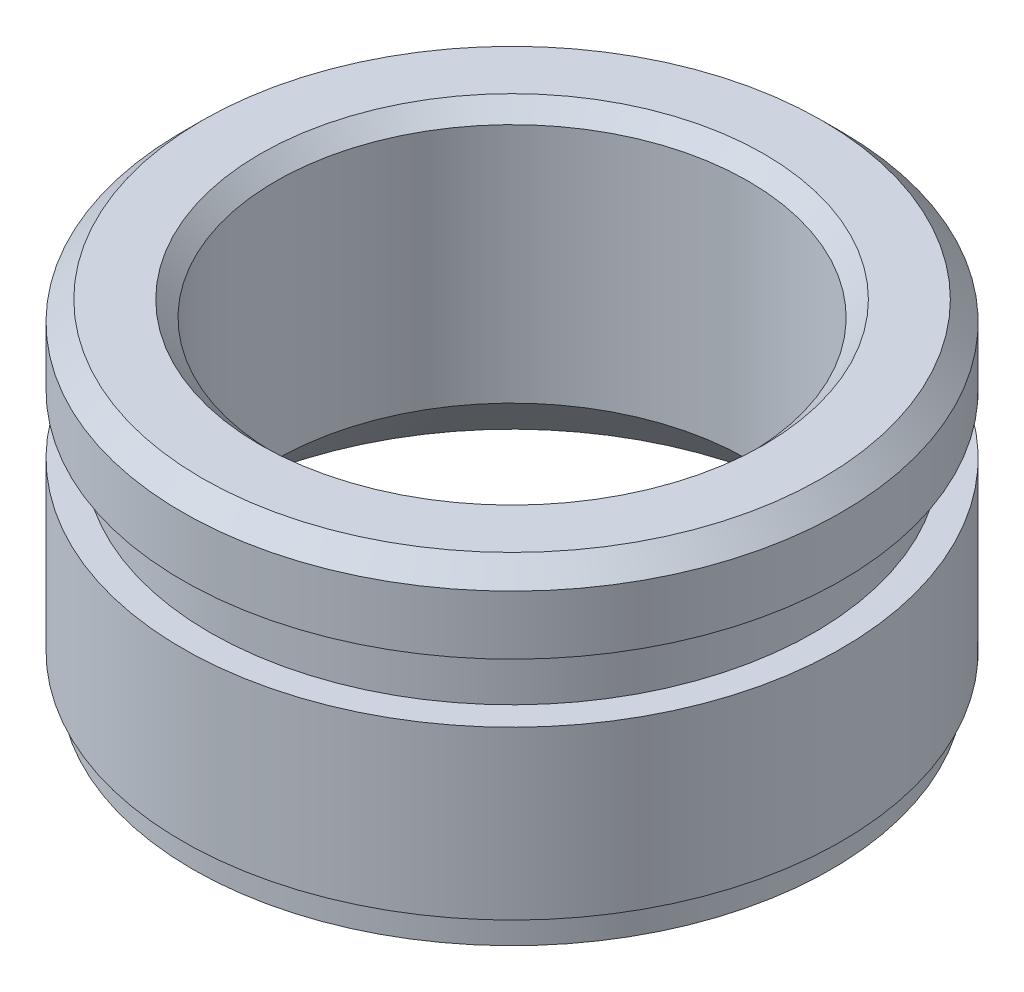
ISO-10303-21;
HEADER;
FILE_DESCRIPTION(('STEP AP214'),'2;1');
FILE_NAME('part.step','',(''),(''),'','','');
FILE_SCHEMA(('AUTOMOTIVE_DESIGN { 1 0 10303 214 1 1 1 1 }'));
ENDSEC;
DATA;
#1=APPLICATION_CONTEXT('core data for automotive mechanical design processes');
#2=APPLICATION_PROTOCOL_DEFINITION('international standard','automotive_design',2000,#1);
#3=PRODUCT_CONTEXT('',#1,'mechanical');
#4=PRODUCT('Part','Part','',(#3));
#5=PRODUCT_RELATED_PRODUCT_CATEGORY('part','',(#4));
#6=PRODUCT_DEFINITION_FORMATION('','',#4);
#7=PRODUCT_DEFINITION_CONTEXT('part definition',#1,'design');
#8=PRODUCT_DEFINITION('design','',#6,#7);
#9=PRODUCT_DEFINITION_SHAPE('','',#8);
#10=(LENGTH_UNIT() NAMED_UNIT(*) SI_UNIT(.MILLI.,.METRE.));
#11=(NAMED_UNIT(*) PLANE_ANGLE_UNIT() SI_UNIT($,.RADIAN.));
#12=(NAMED_UNIT(*) SI_UNIT($,.STERADIAN.) SOLID_ANGLE_UNIT());
#13=UNCERTAINTY_MEASURE_WITH_UNIT(LENGTH_MEASURE(1.E-05),#10,'distance_accuracy_value','');
#14=(GEOMETRIC_REPRESENTATION_CONTEXT(3) GLOBAL_UNCERTAINTY_ASSIGNED_CONTEXT((#13)) GLOBAL_UNIT_ASSIGNED_CONTEXT((#10,
#11,#12)) REPRESENTATION_CONTEXT('',''));
#15=CARTESIAN_POINT('',(0.,0.,0.));
#16=DIRECTION('',(0.,0.,1.));
#17=DIRECTION('',(1.,0.,0.));
#18=AXIS2_PLACEMENT_3D('',#15,#16,#17);
#19=CARTESIAN_POINT('',(0.,3.925,0.));
#20=DIRECTION('',(0.,1.,0.));
#21=DIRECTION('',(0.,0.,1.));
#22=AXIS2_PLACEMENT_3D('',#19,#20,#21);
#23=CYLINDRICAL_SURFACE('',#22,12.025);
#24=CARTESIAN_POINT('',(0.,3.925,0.));
#25=DIRECTION('',(0.,1.,0.));
#26=DIRECTION('',(0.,0.,1.));
#27=AXIS2_PLACEMENT_3D('',#24,#25,#26);
#28=CIRCLE('',#27,12.025);
#29=CARTESIAN_POINT('',(0.,3.925,12.025));
#30=VERTEX_POINT('',#29);
#31=EDGE_CURVE('E54',#30,#30,#28,.T.);
#32=ORIENTED_EDGE('',*,*,#31,.F.);
#33=EDGE_LOOP('',(#32));
#34=FACE_BOUND('',#33,.T.);
#35=CARTESIAN_POINT('',(0.,16.2,0.));
#36=DIRECTION('',(0.,-1.,0.));
#37=DIRECTION('',(0.,0.,-1.));
#38=AXIS2_PLACEMENT_3D('',#35,#36,#37);
#39=CIRCLE('',#38,12.025);
#40=CARTESIAN_POINT('',(0.,16.2,-12.025));
#41=VERTEX_POINT('',#40);
#42=EDGE_CURVE('E58',#41,#41,#39,.T.);
#43=ORIENTED_EDGE('',*,*,#42,.F.);
#44=EDGE_LOOP('',(#43));
#45=FACE_BOUND('',#44,.T.);
#46=ADVANCED_FACE('F13',(#34,#45),#23,.F.);
#47=CARTESIAN_POINT('',(0.,16.2,0.));
#48=DIRECTION('',(0.,1.,0.));
#49=DIRECTION('',(0.,0.,1.));
#50=AXIS2_PLACEMENT_3D('',#47,#48,#49);
#51=CONICAL_SURFACE('',#50,12.025,0.785398163397447);
#52=ORIENTED_EDGE('',*,*,#42,.T.);
#53=EDGE_LOOP('',(#52));
#54=FACE_BOUND('',#53,.T.);
#55=CARTESIAN_POINT('',(0.,17.,0.));
#56=DIRECTION('',(0.,1.,0.));
#57=DIRECTION('',(0.,0.,1.));
#58=AXIS2_PLACEMENT_3D('',#55,#56,#57);
#59=CIRCLE('',#58,12.825);
#60=CARTESIAN_POINT('',(0.,17.,12.825));
#61=VERTEX_POINT('',#60);
#62=EDGE_CURVE('E17',#61,#61,#59,.F.);
#63=ORIENTED_EDGE('',*,*,#62,.F.);
#64=EDGE_LOOP('',(#63));
#65=FACE_BOUND('',#64,.T.);
#66=ADVANCED_FACE('F91',(#54,#65),#51,.F.);
#67=CARTESIAN_POINT('',(0.,0.,0.));
#68=DIRECTION('',(0.,-1.,0.));
#69=DIRECTION('',(0.,0.,-1.));
#70=AXIS2_PLACEMENT_3D('',#67,#68,#69);
#71=CONICAL_SURFACE('',#70,15.95,0.785398163397449);
#72=CARTESIAN_POINT('',(0.,0.,0.));
#73=DIRECTION('',(0.,-1.,0.));
#74=DIRECTION('',(0.,0.,-1.));
#75=AXIS2_PLACEMENT_3D('',#72,#73,#74);
#76=CIRCLE('',#75,15.95);
#77=CARTESIAN_POINT('',(0.,0.,-15.95));
#78=VERTEX_POINT('',#77);
#79=EDGE_CURVE('E49',#78,#78,#76,.F.);
#80=ORIENTED_EDGE('',*,*,#79,.F.);
#81=EDGE_LOOP('',(#80));
#82=FACE_BOUND('',#81,.T.);
#83=ORIENTED_EDGE('',*,*,#31,.T.);
#84=EDGE_LOOP('',(#83));
#85=FACE_BOUND('',#84,.T.);
#86=ADVANCED_FACE('F83',(#82,#85),#71,.F.);
#87=CARTESIAN_POINT('',(-15.775,17.,-16.0905));
#88=DIRECTION('',(0.,1.,0.));
#89=DIRECTION('',(0.,0.,1.));
#90=AXIS2_PLACEMENT_3D('',#87,#88,#89);
#91=PLANE('',#90);
#92=ORIENTED_EDGE('',*,*,#62,.T.);
#93=EDGE_LOOP('',(#92));
#94=FACE_BOUND('',#93,.T.);
#95=CARTESIAN_POINT('',(0.,17.,0.));
#96=DIRECTION('',(0.,-1.,0.));
#97=DIRECTION('',(0.,0.,-1.));
#98=AXIS2_PLACEMENT_3D('',#95,#96,#97);
#99=CIRCLE('',#98,15.775);
#100=CARTESIAN_POINT('',(0.,17.,-15.775));
#101=VERTEX_POINT('',#100);
#102=EDGE_CURVE('E47',#101,#101,#99,.T.);
#103=ORIENTED_EDGE('',*,*,#102,.F.);
#104=EDGE_LOOP('',(#103));
#105=FACE_BOUND('',#104,.T.);
#106=ADVANCED_FACE('F81',(#94,#105),#91,.T.);
#107=CARTESIAN_POINT('',(-16.25,0.,16.575));
#108=DIRECTION('',(0.,-1.,0.));
#109=DIRECTION('',(0.,0.,-1.));
#110=AXIS2_PLACEMENT_3D('',#107,#108,#109);
#111=PLANE('',#110);
#112=ORIENTED_EDGE('',*,*,#79,.T.);
#113=EDGE_LOOP('',(#112));
#114=FACE_BOUND('',#113,.T.);
#115=CARTESIAN_POINT('',(0.,0.,0.));
#116=DIRECTION('',(0.,-1.,0.));
#117=DIRECTION('',(0.,0.,-1.));
#118=AXIS2_PLACEMENT_3D('',#115,#116,#117);
#119=CIRCLE('',#118,16.25);
#120=CARTESIAN_POINT('',(0.,0.,-16.25));
#121=VERTEX_POINT('',#120);
#122=EDGE_CURVE('E44',#121,#121,#119,.F.);
#123=ORIENTED_EDGE('',*,*,#122,.F.);
#124=EDGE_LOOP('',(#123));
#125=FACE_BOUND('',#124,.T.);
#126=ADVANCED_FACE('F77',(#114,#125),#111,.T.);
#127=CARTESIAN_POINT('',(0.,17.,0.));
#128=DIRECTION('',(0.,-1.,0.));
#129=DIRECTION('',(0.,0.,-1.));
#130=AXIS2_PLACEMENT_3D('',#127,#128,#129);
#131=CONICAL_SURFACE('',#130,15.775,0.785398163397447);
#132=CARTESIAN_POINT('',(0.,16.,0.));
#133=DIRECTION('',(0.,-1.,0.));
#134=DIRECTION('',(0.,0.,-1.));
#135=AXIS2_PLACEMENT_3D('',#132,#133,#134);
#136=CIRCLE('',#135,16.775);
#137=CARTESIAN_POINT('',(0.,16.,-16.775));
#138=VERTEX_POINT('',#137);
#139=EDGE_CURVE('E43',#138,#138,#136,.T.);
#140=ORIENTED_EDGE('',*,*,#139,.F.);
#141=EDGE_LOOP('',(#140));
#142=FACE_BOUND('',#141,.T.);
#143=ORIENTED_EDGE('',*,*,#102,.T.);
#144=EDGE_LOOP('',(#143));
#145=FACE_BOUND('',#144,.T.);
#146=ADVANCED_FACE('F73',(#142,#145),#131,.T.);
#147=CARTESIAN_POINT('',(0.,1.5,0.));
#148=DIRECTION('',(0.,-1.,0.));
#149=DIRECTION('',(0.,0.,-1.));
#150=AXIS2_PLACEMENT_3D('',#147,#148,#149);
#151=CYLINDRICAL_SURFACE('',#150,16.25);
#152=ORIENTED_EDGE('',*,*,#122,.T.);
#153=EDGE_LOOP('',(#152));
#154=FACE_BOUND('',#153,.T.);
#155=CARTESIAN_POINT('',(0.,1.5,0.));
#156=DIRECTION('',(0.,-1.,0.));
#157=DIRECTION('',(0.,0.,-1.));
#158=AXIS2_PLACEMENT_3D('',#155,#156,#157);
#159=CIRCLE('',#158,16.25);
#160=CARTESIAN_POINT('',(0.,1.5,-16.25));
#161=VERTEX_POINT('',#160);
#162=EDGE_CURVE('E40',#161,#161,#159,.F.);
#163=ORIENTED_EDGE('',*,*,#162,.F.);
#164=EDGE_LOOP('',(#163));
#165=FACE_BOUND('',#164,.T.);
#166=ADVANCED_FACE('F76',(#154,#165),#151,.T.);
#167=CARTESIAN_POINT('',(0.,16.,0.));
#168=DIRECTION('',(0.,-1.,0.));
#169=DIRECTION('',(0.,0.,-1.));
#170=AXIS2_PLACEMENT_3D('',#167,#168,#169);
#171=CYLINDRICAL_SURFACE('',#170,16.775);
#172=CARTESIAN_POINT('',(0.,13.,0.));
#173=DIRECTION('',(0.,-1.,0.));
#174=DIRECTION('',(0.,0.,-1.));
#175=AXIS2_PLACEMENT_3D('',#172,#173,#174);
#176=CIRCLE('',#175,16.775);
#177=CARTESIAN_POINT('',(0.,13.,-16.775));
#178=VERTEX_POINT('',#177);
#179=EDGE_CURVE('E37',#178,#178,#176,.T.);
#180=ORIENTED_EDGE('',*,*,#179,.F.);
#181=EDGE_LOOP('',(#180));
#182=FACE_BOUND('',#181,.T.);
#183=ORIENTED_EDGE('',*,*,#139,.T.);
#184=EDGE_LOOP('',(#183));
#185=FACE_BOUND('',#184,.T.);
#186=ADVANCED_FACE('F71',(#182,#185),#171,.T.);
#187=CARTESIAN_POINT('',(-16.775,1.5,17.1105));
#188=DIRECTION('',(0.,-1.,0.));
#189=DIRECTION('',(0.,0.,-1.));
#190=AXIS2_PLACEMENT_3D('',#187,#188,#189);
#191=PLANE('',#190);
#192=ORIENTED_EDGE('',*,*,#162,.T.);
#193=EDGE_LOOP('',(#192));
#194=FACE_BOUND('',#193,.T.);
#195=CARTESIAN_POINT('',(0.,1.5,0.));
#196=DIRECTION('',(0.,-1.,0.));
#197=DIRECTION('',(0.,0.,-1.));
#198=AXIS2_PLACEMENT_3D('',#195,#196,#197);
#199=CIRCLE('',#198,16.775);
#200=CARTESIAN_POINT('',(0.,1.5,-16.775));
#201=VERTEX_POINT('',#200);
#202=EDGE_CURVE('E34',#201,#201,#199,.F.);
#203=ORIENTED_EDGE('',*,*,#202,.F.);
#204=EDGE_LOOP('',(#203));
#205=FACE_BOUND('',#204,.T.);
#206=ADVANCED_FACE('F111',(#194,#205),#191,.T.);
#207=CARTESIAN_POINT('',(-17.1105,13.,16.775));
#208=DIRECTION('',(0.,-1.,0.));
#209=DIRECTION('',(0.,0.,-1.));
#210=AXIS2_PLACEMENT_3D('',#207,#208,#209);
#211=PLANE('',#210);
#212=CARTESIAN_POINT('',(0.,13.,0.));
#213=DIRECTION('',(0.,1.,0.));
#214=DIRECTION('',(0.,0.,1.));
#215=AXIS2_PLACEMENT_3D('',#212,#213,#214);
#216=CIRCLE('',#215,15.375);
#217=CARTESIAN_POINT('',(0.,13.,15.375));
#218=VERTEX_POINT('',#217);
#219=EDGE_CURVE('E26',#218,#218,#216,.F.);
#220=ORIENTED_EDGE('',*,*,#219,.F.);
#221=EDGE_LOOP('',(#220));
#222=FACE_BOUND('',#221,.T.);
#223=ORIENTED_EDGE('',*,*,#179,.T.);
#224=EDGE_LOOP('',(#223));
#225=FACE_BOUND('',#224,.T.);
#226=ADVANCED_FACE('F105',(#222,#225),#211,.T.);
#227=CARTESIAN_POINT('',(0.,10.,0.));
#228=DIRECTION('',(0.,-1.,0.));
#229=DIRECTION('',(0.,0.,-1.));
#230=AXIS2_PLACEMENT_3D('',#227,#228,#229);
#231=CYLINDRICAL_SURFACE('',#230,16.775);
#232=ORIENTED_EDGE('',*,*,#202,.T.);
#233=EDGE_LOOP('',(#232));
#234=FACE_BOUND('',#233,.T.);
#235=CARTESIAN_POINT('',(0.,10.,0.));
#236=DIRECTION('',(0.,-1.,0.));
#237=DIRECTION('',(0.,0.,-1.));
#238=AXIS2_PLACEMENT_3D('',#235,#236,#237);
#239=CIRCLE('',#238,16.775);
#240=CARTESIAN_POINT('',(0.,10.,-16.775));
#241=VERTEX_POINT('',#240);
#242=EDGE_CURVE('E21',#241,#241,#239,.F.);
#243=ORIENTED_EDGE('',*,*,#242,.F.);
#244=EDGE_LOOP('',(#243));
#245=FACE_BOUND('',#244,.T.);
#246=ADVANCED_FACE('F99',(#234,#245),#231,.T.);
#247=CARTESIAN_POINT('',(0.,10.,0.));
#248=DIRECTION('',(0.,1.,0.));
#249=DIRECTION('',(0.,0.,1.));
#250=AXIS2_PLACEMENT_3D('',#247,#248,#249);
#251=CYLINDRICAL_SURFACE('',#250,15.375);
#252=CARTESIAN_POINT('',(0.,10.,0.));
#253=DIRECTION('',(0.,1.,0.));
#254=DIRECTION('',(0.,0.,1.));
#255=AXIS2_PLACEMENT_3D('',#252,#253,#254);
#256=CIRCLE('',#255,15.375);
#257=CARTESIAN_POINT('',(0.,10.,15.375));
#258=VERTEX_POINT('',#257);
#259=EDGE_CURVE('E8',#258,#258,#256,.F.);
#260=ORIENTED_EDGE('',*,*,#259,.F.);
#261=EDGE_LOOP('',(#260));
#262=FACE_BOUND('',#261,.T.);
#263=ORIENTED_EDGE('',*,*,#219,.T.);
#264=EDGE_LOOP('',(#263));
#265=FACE_BOUND('',#264,.T.);
#266=ADVANCED_FACE('F95',(#262,#265),#251,.T.);
#267=CARTESIAN_POINT('',(-17.1105,10.,-17.1105));
#268=DIRECTION('',(0.,1.,0.));
#269=DIRECTION('',(0.,0.,1.));
#270=AXIS2_PLACEMENT_3D('',#267,#268,#269);
#271=PLANE('',#270);
#272=ORIENTED_EDGE('',*,*,#259,.T.);
#273=EDGE_LOOP('',(#272));
#274=FACE_BOUND('',#273,.T.);
#275=ORIENTED_EDGE('',*,*,#242,.T.);
#276=EDGE_LOOP('',(#275));
#277=FACE_BOUND('',#276,.T.);
#278=ADVANCED_FACE('F15',(#274,#277),#271,.T.);
#279=CLOSED_SHELL('',(#46,#66,#86,#106,#126,#146,#166,#186,#206,#226,#246,#266,#278));
#280=MANIFOLD_SOLID_BREP('B1',#279);
#281=ADVANCED_BREP_SHAPE_REPRESENTATION('',(#18,#280),#14);
#282=SHAPE_DEFINITION_REPRESENTATION(#9,#281);
ENDSEC;
END-ISO-10303-21;
